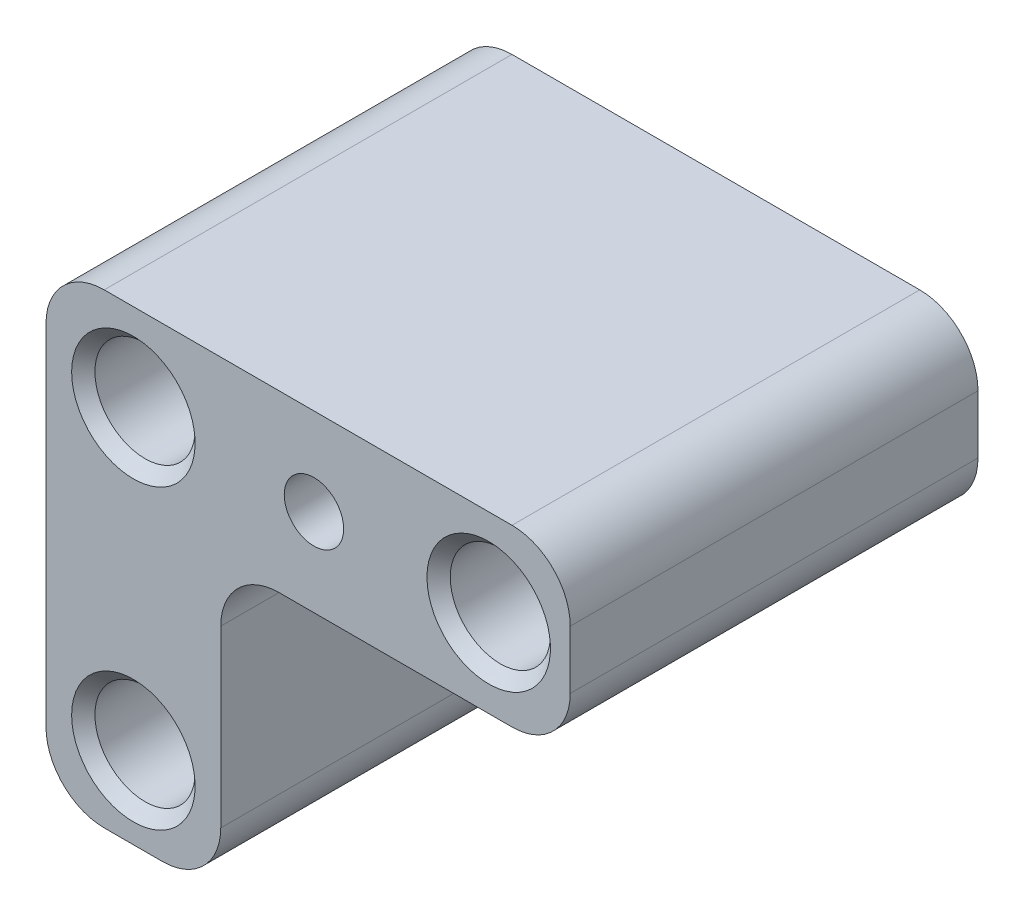
ISO-10303-21;
HEADER;
FILE_DESCRIPTION(('STEP AP214'),'2;1');
FILE_NAME('part.step','',(''),(''),'','','');
FILE_SCHEMA(('AUTOMOTIVE_DESIGN { 1 0 10303 214 1 1 1 1 }'));
ENDSEC;
DATA;
#1=APPLICATION_CONTEXT('core data for automotive mechanical design processes');
#2=APPLICATION_PROTOCOL_DEFINITION('international standard','automotive_design',2000,#1);
#3=PRODUCT_CONTEXT('',#1,'mechanical');
#4=PRODUCT('Part','Part','',(#3));
#5=PRODUCT_RELATED_PRODUCT_CATEGORY('part','',(#4));
#6=PRODUCT_DEFINITION_FORMATION('','',#4);
#7=PRODUCT_DEFINITION_CONTEXT('part definition',#1,'design');
#8=PRODUCT_DEFINITION('design','',#6,#7);
#9=PRODUCT_DEFINITION_SHAPE('','',#8);
#10=(LENGTH_UNIT() NAMED_UNIT(*) SI_UNIT(.MILLI.,.METRE.));
#11=(NAMED_UNIT(*) PLANE_ANGLE_UNIT() SI_UNIT($,.RADIAN.));
#12=(NAMED_UNIT(*) SI_UNIT($,.STERADIAN.) SOLID_ANGLE_UNIT());
#13=UNCERTAINTY_MEASURE_WITH_UNIT(LENGTH_MEASURE(1.E-05),#10,'distance_accuracy_value','');
#14=(GEOMETRIC_REPRESENTATION_CONTEXT(3) GLOBAL_UNCERTAINTY_ASSIGNED_CONTEXT((#13)) GLOBAL_UNIT_ASSIGNED_CONTEXT((#10,
#11,#12)) REPRESENTATION_CONTEXT('',''));
#15=CARTESIAN_POINT('',(0.,0.,0.));
#16=DIRECTION('',(0.,0.,1.));
#17=DIRECTION('',(1.,0.,0.));
#18=AXIS2_PLACEMENT_3D('',#15,#16,#17);
#19=CARTESIAN_POINT('',(-319.,352.5,35.));
#20=DIRECTION('',(0.,0.,-1.));
#21=DIRECTION('',(-1.,0.,0.));
#22=AXIS2_PLACEMENT_3D('',#19,#20,#21);
#23=CYLINDRICAL_SURFACE('',#22,2.55);
#24=CARTESIAN_POINT('',(-319.,352.5,0.));
#25=DIRECTION('',(0.,0.,1.));
#26=DIRECTION('',(1.,0.,0.));
#27=AXIS2_PLACEMENT_3D('',#24,#25,#26);
#28=CIRCLE('',#27,2.55);
#29=CARTESIAN_POINT('',(-316.45,352.5,0.));
#30=VERTEX_POINT('',#29);
#31=EDGE_CURVE('E240',#30,#30,#28,.T.);
#32=ORIENTED_EDGE('',*,*,#31,.F.);
#33=EDGE_LOOP('',(#32));
#34=FACE_BOUND('',#33,.T.);
#35=CARTESIAN_POINT('',(-319.,352.5,5.4));
#36=DIRECTION('',(0.,0.,1.));
#37=DIRECTION('',(1.,0.,0.));
#38=AXIS2_PLACEMENT_3D('',#35,#36,#37);
#39=CIRCLE('',#38,2.55);
#40=CARTESIAN_POINT('',(-316.45,352.5,5.4));
#41=VERTEX_POINT('',#40);
#42=EDGE_CURVE('E265',#41,#41,#39,.T.);
#43=ORIENTED_EDGE('',*,*,#42,.T.);
#44=EDGE_LOOP('',(#43));
#45=FACE_BOUND('',#44,.T.);
#46=ADVANCED_FACE('F116',(#34,#45),#23,.F.);
#47=CARTESIAN_POINT('',(-319.,327.,35.));
#48=DIRECTION('',(0.,0.,-1.));
#49=DIRECTION('',(-1.,0.,0.));
#50=AXIS2_PLACEMENT_3D('',#47,#48,#49);
#51=CYLINDRICAL_SURFACE('',#50,2.55);
#52=CARTESIAN_POINT('',(-319.,327.,0.));
#53=DIRECTION('',(0.,0.,1.));
#54=DIRECTION('',(1.,0.,0.));
#55=AXIS2_PLACEMENT_3D('',#52,#53,#54);
#56=CIRCLE('',#55,2.55);
#57=CARTESIAN_POINT('',(-316.45,327.,0.));
#58=VERTEX_POINT('',#57);
#59=EDGE_CURVE('E247',#58,#58,#56,.T.);
#60=ORIENTED_EDGE('',*,*,#59,.F.);
#61=EDGE_LOOP('',(#60));
#62=FACE_BOUND('',#61,.T.);
#63=CARTESIAN_POINT('',(-319.,327.,5.4));
#64=DIRECTION('',(0.,0.,1.));
#65=DIRECTION('',(1.,0.,0.));
#66=AXIS2_PLACEMENT_3D('',#63,#64,#65);
#67=CIRCLE('',#66,2.55);
#68=CARTESIAN_POINT('',(-316.45,327.,5.4));
#69=VERTEX_POINT('',#68);
#70=EDGE_CURVE('E282',#69,#69,#67,.T.);
#71=ORIENTED_EDGE('',*,*,#70,.T.);
#72=EDGE_LOOP('',(#71));
#73=FACE_BOUND('',#72,.T.);
#74=ADVANCED_FACE('F400',(#62,#73),#51,.F.);
#75=CARTESIAN_POINT('',(-288.5,352.5,35.));
#76=DIRECTION('',(0.,0.,-1.));
#77=DIRECTION('',(-1.,0.,0.));
#78=AXIS2_PLACEMENT_3D('',#75,#76,#77);
#79=CYLINDRICAL_SURFACE('',#78,2.55);
#80=CARTESIAN_POINT('',(-288.5,352.5,0.));
#81=DIRECTION('',(0.,0.,1.));
#82=DIRECTION('',(1.,0.,0.));
#83=AXIS2_PLACEMENT_3D('',#80,#81,#82);
#84=CIRCLE('',#83,2.55);
#85=CARTESIAN_POINT('',(-285.95,352.5,0.));
#86=VERTEX_POINT('',#85);
#87=EDGE_CURVE('E260',#86,#86,#84,.T.);
#88=ORIENTED_EDGE('',*,*,#87,.F.);
#89=EDGE_LOOP('',(#88));
#90=FACE_BOUND('',#89,.T.);
#91=CARTESIAN_POINT('',(-288.5,352.5,5.4));
#92=DIRECTION('',(0.,0.,1.));
#93=DIRECTION('',(1.,0.,0.));
#94=AXIS2_PLACEMENT_3D('',#91,#92,#93);
#95=CIRCLE('',#94,2.55);
#96=CARTESIAN_POINT('',(-285.95,352.5,5.4));
#97=VERTEX_POINT('',#96);
#98=EDGE_CURVE('E278',#97,#97,#95,.T.);
#99=ORIENTED_EDGE('',*,*,#98,.T.);
#100=EDGE_LOOP('',(#99));
#101=FACE_BOUND('',#100,.T.);
#102=ADVANCED_FACE('F406',(#90,#101),#79,.F.);
#103=CARTESIAN_POINT('',(-311.5,320.,35.));
#104=DIRECTION('',(-1.,0.,0.));
#105=DIRECTION('',(0.,0.,1.));
#106=AXIS2_PLACEMENT_3D('',#103,#104,#105);
#107=PLANE('',#106);
#108=DIRECTION('',(0.,1.,0.));
#109=VECTOR('',#108,1.);
#110=CARTESIAN_POINT('',(-311.5,320.,0.));
#111=LINE('',#110,#109);
#112=CARTESIAN_POINT('',(-311.5,325.,0.));
#113=VERTEX_POINT('',#112);
#114=CARTESIAN_POINT('',(-311.5,340.,0.));
#115=VERTEX_POINT('',#114);
#116=EDGE_CURVE('E256',#113,#115,#111,.T.);
#117=ORIENTED_EDGE('',*,*,#116,.T.);
#118=DIRECTION('',(0.,0.,-1.));
#119=VECTOR('',#118,1.);
#120=CARTESIAN_POINT('',(-311.5,340.,35.));
#121=LINE('',#120,#119);
#122=CARTESIAN_POINT('',(-311.5,340.,35.));
#123=VERTEX_POINT('',#122);
#124=EDGE_CURVE('E338',#115,#123,#121,.F.);
#125=ORIENTED_EDGE('',*,*,#124,.T.);
#126=DIRECTION('',(0.,1.,0.));
#127=VECTOR('',#126,1.);
#128=CARTESIAN_POINT('',(-311.5,320.,35.));
#129=LINE('',#128,#127);
#130=CARTESIAN_POINT('',(-311.5,325.,35.));
#131=VERTEX_POINT('',#130);
#132=EDGE_CURVE('E250',#131,#123,#129,.T.);
#133=ORIENTED_EDGE('',*,*,#132,.F.);
#134=DIRECTION('',(0.,0.,-1.));
#135=VECTOR('',#134,1.);
#136=CARTESIAN_POINT('',(-311.5,325.,0.));
#137=LINE('',#136,#135);
#138=EDGE_CURVE('E334',#131,#113,#137,.T.);
#139=ORIENTED_EDGE('',*,*,#138,.T.);
#140=EDGE_LOOP('',(#117,#125,#133,#139));
#141=FACE_BOUND('',#140,.T.);
#142=ADVANCED_FACE('F416',(#141),#107,.F.);
#143=CARTESIAN_POINT('',(0.,0.,35.));
#144=DIRECTION('',(0.,0.,-1.));
#145=DIRECTION('',(-1.,0.,0.));
#146=AXIS2_PLACEMENT_3D('',#143,#144,#145);
#147=PLANE('',#146);
#148=CARTESIAN_POINT('',(-288.5,352.5,35.));
#149=DIRECTION('',(0.,0.,-1.));
#150=DIRECTION('',(-1.,0.,0.));
#151=AXIS2_PLACEMENT_3D('',#148,#149,#150);
#152=CIRCLE('',#151,5.30000000000003);
#153=CARTESIAN_POINT('',(-293.8,352.5,35.));
#154=VERTEX_POINT('',#153);
#155=EDGE_CURVE('E372',#154,#154,#152,.T.);
#156=ORIENTED_EDGE('',*,*,#155,.T.);
#157=EDGE_LOOP('',(#156));
#158=FACE_BOUND('',#157,.T.);
#159=CARTESIAN_POINT('',(-319.,352.5,35.));
#160=DIRECTION('',(0.,0.,-1.));
#161=DIRECTION('',(-1.,0.,0.));
#162=AXIS2_PLACEMENT_3D('',#159,#160,#161);
#163=CIRCLE('',#162,5.30000000000003);
#164=CARTESIAN_POINT('',(-324.3,352.5,35.));
#165=VERTEX_POINT('',#164);
#166=EDGE_CURVE('E368',#165,#165,#163,.T.);
#167=ORIENTED_EDGE('',*,*,#166,.T.);
#168=EDGE_LOOP('',(#167));
#169=FACE_BOUND('',#168,.T.);
#170=CARTESIAN_POINT('',(-319.,327.,35.));
#171=DIRECTION('',(0.,0.,-1.));
#172=DIRECTION('',(-1.,0.,0.));
#173=AXIS2_PLACEMENT_3D('',#170,#171,#172);
#174=CIRCLE('',#173,5.30000000000003);
#175=CARTESIAN_POINT('',(-324.3,327.,35.));
#176=VERTEX_POINT('',#175);
#177=EDGE_CURVE('E364',#176,#176,#174,.T.);
#178=ORIENTED_EDGE('',*,*,#177,.T.);
#179=EDGE_LOOP('',(#178));
#180=FACE_BOUND('',#179,.T.);
#181=CARTESIAN_POINT('',(-303.5,352.5,35.));
#182=DIRECTION('',(0.,0.,-1.));
#183=DIRECTION('',(-1.,0.,0.));
#184=AXIS2_PLACEMENT_3D('',#181,#182,#183);
#185=CIRCLE('',#184,2.55);
#186=CARTESIAN_POINT('',(-306.05,352.5,35.));
#187=VERTEX_POINT('',#186);
#188=EDGE_CURVE('E290',#187,#187,#185,.T.);
#189=ORIENTED_EDGE('',*,*,#188,.T.);
#190=EDGE_LOOP('',(#189));
#191=FACE_BOUND('',#190,.T.);
#192=DIRECTION('',(0.,-1.,0.));
#193=VECTOR('',#192,1.);
#194=CARTESIAN_POINT('',(-281.5,360.,35.));
#195=LINE('',#194,#193);
#196=CARTESIAN_POINT('',(-281.5,355.,35.));
#197=VERTEX_POINT('',#196);
#198=CARTESIAN_POINT('',(-281.5,350.,35.));
#199=VERTEX_POINT('',#198);
#200=EDGE_CURVE('E266',#197,#199,#195,.T.);
#201=ORIENTED_EDGE('',*,*,#200,.F.);
#202=CARTESIAN_POINT('',(-286.5,355.,35.));
#203=DIRECTION('',(0.,0.,-1.));
#204=DIRECTION('',(-1.,0.,0.));
#205=AXIS2_PLACEMENT_3D('',#202,#203,#204);
#206=CIRCLE('',#205,5.);
#207=CARTESIAN_POINT('',(-286.5,360.,35.));
#208=VERTEX_POINT('',#207);
#209=EDGE_CURVE('E325',#197,#208,#206,.F.);
#210=ORIENTED_EDGE('',*,*,#209,.T.);
#211=DIRECTION('',(-1.,0.,0.));
#212=VECTOR('',#211,1.);
#213=CARTESIAN_POINT('',(-311.5,360.,35.));
#214=LINE('',#213,#212);
#215=CARTESIAN_POINT('',(-321.5,360.,35.));
#216=VERTEX_POINT('',#215);
#217=EDGE_CURVE('E230',#208,#216,#214,.T.);
#218=ORIENTED_EDGE('',*,*,#217,.T.);
#219=CARTESIAN_POINT('',(-321.5,355.,35.));
#220=DIRECTION('',(0.,0.,-1.));
#221=DIRECTION('',(-1.,0.,0.));
#222=AXIS2_PLACEMENT_3D('',#219,#220,#221);
#223=CIRCLE('',#222,5.);
#224=CARTESIAN_POINT('',(-326.5,355.,35.));
#225=VERTEX_POINT('',#224);
#226=EDGE_CURVE('E313',#216,#225,#223,.F.);
#227=ORIENTED_EDGE('',*,*,#226,.T.);
#228=DIRECTION('',(0.,1.,0.));
#229=VECTOR('',#228,1.);
#230=CARTESIAN_POINT('',(-326.5,320.,35.));
#231=LINE('',#230,#229);
#232=CARTESIAN_POINT('',(-326.5,325.,35.));
#233=VERTEX_POINT('',#232);
#234=EDGE_CURVE('E513',#233,#225,#231,.T.);
#235=ORIENTED_EDGE('',*,*,#234,.F.);
#236=CARTESIAN_POINT('',(-321.5,325.,35.));
#237=DIRECTION('',(0.,0.,-1.));
#238=DIRECTION('',(-1.,0.,0.));
#239=AXIS2_PLACEMENT_3D('',#236,#237,#238);
#240=CIRCLE('',#239,5.);
#241=CARTESIAN_POINT('',(-321.5,320.,35.));
#242=VERTEX_POINT('',#241);
#243=EDGE_CURVE('E316',#233,#242,#240,.F.);
#244=ORIENTED_EDGE('',*,*,#243,.T.);
#245=DIRECTION('',(-1.,0.,0.));
#246=VECTOR('',#245,1.);
#247=CARTESIAN_POINT('',(-311.5,320.,35.));
#248=LINE('',#247,#246);
#249=CARTESIAN_POINT('',(-316.5,320.,35.));
#250=VERTEX_POINT('',#249);
#251=EDGE_CURVE('E516',#250,#242,#248,.T.);
#252=ORIENTED_EDGE('',*,*,#251,.F.);
#253=CARTESIAN_POINT('',(-316.5,325.,35.));
#254=DIRECTION('',(0.,0.,-1.));
#255=DIRECTION('',(-1.,0.,0.));
#256=AXIS2_PLACEMENT_3D('',#253,#254,#255);
#257=CIRCLE('',#256,5.);
#258=EDGE_CURVE('E319',#250,#131,#257,.F.);
#259=ORIENTED_EDGE('',*,*,#258,.T.);
#260=ORIENTED_EDGE('',*,*,#132,.T.);
#261=CARTESIAN_POINT('',(-306.5,340.,35.));
#262=DIRECTION('',(0.,0.,-1.));
#263=DIRECTION('',(-1.,0.,0.));
#264=AXIS2_PLACEMENT_3D('',#261,#262,#263);
#265=CIRCLE('',#264,5.);
#266=CARTESIAN_POINT('',(-306.5,345.,35.));
#267=VERTEX_POINT('',#266);
#268=EDGE_CURVE('E140',#123,#267,#265,.T.);
#269=ORIENTED_EDGE('',*,*,#268,.T.);
#270=DIRECTION('',(1.,0.,0.));
#271=VECTOR('',#270,1.);
#272=CARTESIAN_POINT('',(-311.5,345.,35.));
#273=LINE('',#272,#271);
#274=CARTESIAN_POINT('',(-286.5,345.,35.));
#275=VERTEX_POINT('',#274);
#276=EDGE_CURVE('E270',#267,#275,#273,.T.);
#277=ORIENTED_EDGE('',*,*,#276,.T.);
#278=CARTESIAN_POINT('',(-286.5,350.,35.));
#279=DIRECTION('',(0.,0.,-1.));
#280=DIRECTION('',(-1.,0.,0.));
#281=AXIS2_PLACEMENT_3D('',#278,#279,#280);
#282=CIRCLE('',#281,5.);
#283=EDGE_CURVE('E322',#275,#199,#282,.F.);
#284=ORIENTED_EDGE('',*,*,#283,.T.);
#285=EDGE_LOOP('',(#201,#210,#218,#227,#235,#244,#252,#259,#260,#269,#277,#284));
#286=FACE_BOUND('',#285,.T.);
#287=ADVANCED_FACE('F413',(#158,#169,#180,#191,#286),#147,.F.);
#288=CARTESIAN_POINT('',(0.,0.,0.));
#289=DIRECTION('',(0.,0.,-1.));
#290=DIRECTION('',(-1.,0.,0.));
#291=AXIS2_PLACEMENT_3D('',#288,#289,#290);
#292=PLANE('',#291);
#293=CARTESIAN_POINT('',(-303.5,352.5,0.));
#294=DIRECTION('',(0.,0.,-1.));
#295=DIRECTION('',(-1.,0.,0.));
#296=AXIS2_PLACEMENT_3D('',#293,#294,#295);
#297=CIRCLE('',#296,5.30000000000003);
#298=CARTESIAN_POINT('',(-308.8,352.5,0.));
#299=VERTEX_POINT('',#298);
#300=EDGE_CURVE('E12',#299,#299,#297,.F.);
#301=ORIENTED_EDGE('',*,*,#300,.T.);
#302=EDGE_LOOP('',(#301));
#303=FACE_BOUND('',#302,.T.);
#304=ORIENTED_EDGE('',*,*,#31,.T.);
#305=EDGE_LOOP('',(#304));
#306=FACE_BOUND('',#305,.T.);
#307=DIRECTION('',(-1.,0.,0.));
#308=VECTOR('',#307,1.);
#309=CARTESIAN_POINT('',(-311.5,360.,0.));
#310=LINE('',#309,#308);
#311=CARTESIAN_POINT('',(-286.5,360.,0.));
#312=VERTEX_POINT('',#311);
#313=CARTESIAN_POINT('',(-321.5,360.,0.));
#314=VERTEX_POINT('',#313);
#315=EDGE_CURVE('E227',#312,#314,#310,.T.);
#316=ORIENTED_EDGE('',*,*,#315,.F.);
#317=CARTESIAN_POINT('',(-286.5,355.,0.));
#318=DIRECTION('',(0.,0.,-1.));
#319=DIRECTION('',(-1.,0.,0.));
#320=AXIS2_PLACEMENT_3D('',#317,#318,#319);
#321=CIRCLE('',#320,5.);
#322=CARTESIAN_POINT('',(-281.5,355.,0.));
#323=VERTEX_POINT('',#322);
#324=EDGE_CURVE('E209',#312,#323,#321,.T.);
#325=ORIENTED_EDGE('',*,*,#324,.T.);
#326=DIRECTION('',(0.,-1.,0.));
#327=VECTOR('',#326,1.);
#328=CARTESIAN_POINT('',(-281.5,360.,0.));
#329=LINE('',#328,#327);
#330=CARTESIAN_POINT('',(-281.5,350.,0.));
#331=VERTEX_POINT('',#330);
#332=EDGE_CURVE('E264',#323,#331,#329,.T.);
#333=ORIENTED_EDGE('',*,*,#332,.T.);
#334=CARTESIAN_POINT('',(-286.5,350.,0.));
#335=DIRECTION('',(0.,0.,-1.));
#336=DIRECTION('',(-1.,0.,0.));
#337=AXIS2_PLACEMENT_3D('',#334,#335,#336);
#338=CIRCLE('',#337,5.);
#339=CARTESIAN_POINT('',(-286.5,345.,0.));
#340=VERTEX_POINT('',#339);
#341=EDGE_CURVE('E221',#331,#340,#338,.T.);
#342=ORIENTED_EDGE('',*,*,#341,.T.);
#343=DIRECTION('',(1.,0.,0.));
#344=VECTOR('',#343,1.);
#345=CARTESIAN_POINT('',(-311.5,345.,0.));
#346=LINE('',#345,#344);
#347=CARTESIAN_POINT('',(-306.5,345.,0.));
#348=VERTEX_POINT('',#347);
#349=EDGE_CURVE('E271',#348,#340,#346,.T.);
#350=ORIENTED_EDGE('',*,*,#349,.F.);
#351=CARTESIAN_POINT('',(-306.5,340.,0.));
#352=DIRECTION('',(0.,0.,-1.));
#353=DIRECTION('',(-1.,0.,0.));
#354=AXIS2_PLACEMENT_3D('',#351,#352,#353);
#355=CIRCLE('',#354,5.);
#356=EDGE_CURVE('E355',#348,#115,#355,.F.);
#357=ORIENTED_EDGE('',*,*,#356,.T.);
#358=ORIENTED_EDGE('',*,*,#116,.F.);
#359=CARTESIAN_POINT('',(-316.5,325.,0.));
#360=DIRECTION('',(0.,0.,-1.));
#361=DIRECTION('',(-1.,0.,0.));
#362=AXIS2_PLACEMENT_3D('',#359,#360,#361);
#363=CIRCLE('',#362,5.);
#364=CARTESIAN_POINT('',(-316.5,320.,0.));
#365=VERTEX_POINT('',#364);
#366=EDGE_CURVE('E303',#113,#365,#363,.T.);
#367=ORIENTED_EDGE('',*,*,#366,.T.);
#368=DIRECTION('',(-1.,0.,0.));
#369=VECTOR('',#368,1.);
#370=CARTESIAN_POINT('',(-311.5,320.,0.));
#371=LINE('',#370,#369);
#372=CARTESIAN_POINT('',(-321.5,320.,0.));
#373=VERTEX_POINT('',#372);
#374=EDGE_CURVE('E244',#365,#373,#371,.T.);
#375=ORIENTED_EDGE('',*,*,#374,.T.);
#376=CARTESIAN_POINT('',(-321.5,325.,0.));
#377=DIRECTION('',(0.,0.,-1.));
#378=DIRECTION('',(-1.,0.,0.));
#379=AXIS2_PLACEMENT_3D('',#376,#377,#378);
#380=CIRCLE('',#379,5.);
#381=CARTESIAN_POINT('',(-326.5,325.,0.));
#382=VERTEX_POINT('',#381);
#383=EDGE_CURVE('E300',#373,#382,#380,.T.);
#384=ORIENTED_EDGE('',*,*,#383,.T.);
#385=DIRECTION('',(0.,1.,0.));
#386=VECTOR('',#385,1.);
#387=CARTESIAN_POINT('',(-326.5,320.,0.));
#388=LINE('',#387,#386);
#389=CARTESIAN_POINT('',(-326.5,355.,0.));
#390=VERTEX_POINT('',#389);
#391=EDGE_CURVE('E239',#382,#390,#388,.T.);
#392=ORIENTED_EDGE('',*,*,#391,.T.);
#393=CARTESIAN_POINT('',(-321.5,355.,0.));
#394=DIRECTION('',(0.,0.,-1.));
#395=DIRECTION('',(-1.,0.,0.));
#396=AXIS2_PLACEMENT_3D('',#393,#394,#395);
#397=CIRCLE('',#396,5.);
#398=EDGE_CURVE('E232',#390,#314,#397,.T.);
#399=ORIENTED_EDGE('',*,*,#398,.T.);
#400=EDGE_LOOP('',(#316,#325,#333,#342,#350,#357,#358,#367,#375,#384,#392,#399));
#401=FACE_BOUND('',#400,.T.);
#402=ORIENTED_EDGE('',*,*,#59,.T.);
#403=EDGE_LOOP('',(#402));
#404=FACE_BOUND('',#403,.T.);
#405=ORIENTED_EDGE('',*,*,#87,.T.);
#406=EDGE_LOOP('',(#405));
#407=FACE_BOUND('',#406,.T.);
#408=ADVANCED_FACE('F235',(#303,#306,#401,#404,#407),#292,.T.);
#409=CARTESIAN_POINT('',(-311.5,360.,35.));
#410=DIRECTION('',(0.,-1.,0.));
#411=DIRECTION('',(0.,0.,-1.));
#412=AXIS2_PLACEMENT_3D('',#409,#410,#411);
#413=PLANE('',#412);
#414=ORIENTED_EDGE('',*,*,#217,.F.);
#415=DIRECTION('',(0.,0.,-1.));
#416=VECTOR('',#415,1.);
#417=CARTESIAN_POINT('',(-286.5,360.,0.));
#418=LINE('',#417,#416);
#419=EDGE_CURVE('E213',#208,#312,#418,.T.);
#420=ORIENTED_EDGE('',*,*,#419,.T.);
#421=ORIENTED_EDGE('',*,*,#315,.T.);
#422=DIRECTION('',(0.,0.,-1.));
#423=VECTOR('',#422,1.);
#424=CARTESIAN_POINT('',(-321.5,360.,35.));
#425=LINE('',#424,#423);
#426=EDGE_CURVE('E233',#314,#216,#425,.F.);
#427=ORIENTED_EDGE('',*,*,#426,.T.);
#428=EDGE_LOOP('',(#414,#420,#421,#427));
#429=FACE_BOUND('',#428,.T.);
#430=ADVANCED_FACE('F226',(#429),#413,.F.);
#431=CARTESIAN_POINT('',(-326.5,320.,35.));
#432=DIRECTION('',(-1.,0.,0.));
#433=DIRECTION('',(0.,0.,1.));
#434=AXIS2_PLACEMENT_3D('',#431,#432,#433);
#435=PLANE('',#434);
#436=ORIENTED_EDGE('',*,*,#391,.F.);
#437=DIRECTION('',(0.,0.,-1.));
#438=VECTOR('',#437,1.);
#439=CARTESIAN_POINT('',(-326.5,325.,35.));
#440=LINE('',#439,#438);
#441=EDGE_CURVE('E352',#382,#233,#440,.F.);
#442=ORIENTED_EDGE('',*,*,#441,.T.);
#443=ORIENTED_EDGE('',*,*,#234,.T.);
#444=DIRECTION('',(0.,0.,-1.));
#445=VECTOR('',#444,1.);
#446=CARTESIAN_POINT('',(-326.5,355.,0.));
#447=LINE('',#446,#445);
#448=EDGE_CURVE('E348',#225,#390,#447,.T.);
#449=ORIENTED_EDGE('',*,*,#448,.T.);
#450=EDGE_LOOP('',(#436,#442,#443,#449));
#451=FACE_BOUND('',#450,.T.);
#452=ADVANCED_FACE('F428',(#451),#435,.T.);
#453=CARTESIAN_POINT('',(-311.5,320.,35.));
#454=DIRECTION('',(0.,-1.,0.));
#455=DIRECTION('',(0.,0.,-1.));
#456=AXIS2_PLACEMENT_3D('',#453,#454,#455);
#457=PLANE('',#456);
#458=ORIENTED_EDGE('',*,*,#374,.F.);
#459=DIRECTION('',(0.,0.,-1.));
#460=VECTOR('',#459,1.);
#461=CARTESIAN_POINT('',(-316.5,320.,35.));
#462=LINE('',#461,#460);
#463=EDGE_CURVE('E345',#365,#250,#462,.F.);
#464=ORIENTED_EDGE('',*,*,#463,.T.);
#465=ORIENTED_EDGE('',*,*,#251,.T.);
#466=DIRECTION('',(0.,0.,-1.));
#467=VECTOR('',#466,1.);
#468=CARTESIAN_POINT('',(-321.5,320.,35.));
#469=LINE('',#468,#467);
#470=EDGE_CURVE('E341',#242,#373,#469,.T.);
#471=ORIENTED_EDGE('',*,*,#470,.T.);
#472=EDGE_LOOP('',(#458,#464,#465,#471));
#473=FACE_BOUND('',#472,.T.);
#474=ADVANCED_FACE('F425',(#473),#457,.T.);
#475=CARTESIAN_POINT('',(-281.5,360.,35.));
#476=DIRECTION('',(1.,0.,0.));
#477=DIRECTION('',(0.,0.,-1.));
#478=AXIS2_PLACEMENT_3D('',#475,#476,#477);
#479=PLANE('',#478);
#480=ORIENTED_EDGE('',*,*,#332,.F.);
#481=DIRECTION('',(0.,0.,-1.));
#482=VECTOR('',#481,1.);
#483=CARTESIAN_POINT('',(-281.5,355.,35.));
#484=LINE('',#483,#482);
#485=EDGE_CURVE('E214',#323,#197,#484,.F.);
#486=ORIENTED_EDGE('',*,*,#485,.T.);
#487=ORIENTED_EDGE('',*,*,#200,.T.);
#488=DIRECTION('',(0.,0.,-1.));
#489=VECTOR('',#488,1.);
#490=CARTESIAN_POINT('',(-281.5,350.,0.));
#491=LINE('',#490,#489);
#492=EDGE_CURVE('E220',#199,#331,#491,.T.);
#493=ORIENTED_EDGE('',*,*,#492,.T.);
#494=EDGE_LOOP('',(#480,#486,#487,#493));
#495=FACE_BOUND('',#494,.T.);
#496=ADVANCED_FACE('F424',(#495),#479,.T.);
#497=CARTESIAN_POINT('',(-311.5,345.,35.));
#498=DIRECTION('',(0.,1.,0.));
#499=DIRECTION('',(0.,0.,1.));
#500=AXIS2_PLACEMENT_3D('',#497,#498,#499);
#501=PLANE('',#500);
#502=ORIENTED_EDGE('',*,*,#349,.T.);
#503=DIRECTION('',(0.,0.,-1.));
#504=VECTOR('',#503,1.);
#505=CARTESIAN_POINT('',(-286.5,345.,35.));
#506=LINE('',#505,#504);
#507=EDGE_CURVE('E133',#340,#275,#506,.F.);
#508=ORIENTED_EDGE('',*,*,#507,.T.);
#509=ORIENTED_EDGE('',*,*,#276,.F.);
#510=DIRECTION('',(0.,0.,-1.));
#511=VECTOR('',#510,1.);
#512=CARTESIAN_POINT('',(-306.5,345.,0.));
#513=LINE('',#512,#511);
#514=EDGE_CURVE('E328',#267,#348,#513,.T.);
#515=ORIENTED_EDGE('',*,*,#514,.T.);
#516=EDGE_LOOP('',(#502,#508,#509,#515));
#517=FACE_BOUND('',#516,.T.);
#518=ADVANCED_FACE('F439',(#517),#501,.F.);
#519=CARTESIAN_POINT('',(-288.5,352.5,5.4));
#520=DIRECTION('',(0.,0.,1.));
#521=DIRECTION('',(1.,0.,0.));
#522=AXIS2_PLACEMENT_3D('',#519,#520,#521);
#523=CYLINDRICAL_SURFACE('',#522,4.30000000000004);
#524=CARTESIAN_POINT('',(-288.5,352.5,34.));
#525=DIRECTION('',(0.,0.,-1.));
#526=DIRECTION('',(-1.,0.,0.));
#527=AXIS2_PLACEMENT_3D('',#524,#525,#526);
#528=CIRCLE('',#527,4.30000000000004);
#529=CARTESIAN_POINT('',(-292.8,352.5,34.));
#530=VERTEX_POINT('',#529);
#531=EDGE_CURVE('E360',#530,#530,#528,.F.);
#532=ORIENTED_EDGE('',*,*,#531,.T.);
#533=EDGE_LOOP('',(#532));
#534=FACE_BOUND('',#533,.T.);
#535=CARTESIAN_POINT('',(-288.5,352.5,5.4));
#536=DIRECTION('',(0.,0.,1.));
#537=DIRECTION('',(1.,0.,0.));
#538=AXIS2_PLACEMENT_3D('',#535,#536,#537);
#539=CIRCLE('',#538,4.30000000000004);
#540=CARTESIAN_POINT('',(-284.2,352.5,5.4));
#541=VERTEX_POINT('',#540);
#542=EDGE_CURVE('E504',#541,#541,#539,.T.);
#543=ORIENTED_EDGE('',*,*,#542,.F.);
#544=EDGE_LOOP('',(#543));
#545=FACE_BOUND('',#544,.T.);
#546=ADVANCED_FACE('F430',(#534,#545),#523,.F.);
#547=CARTESIAN_POINT('',(-288.5,352.5,5.4));
#548=DIRECTION('',(0.,0.,1.));
#549=DIRECTION('',(1.,0.,0.));
#550=AXIS2_PLACEMENT_3D('',#547,#548,#549);
#551=PLANE('',#550);
#552=ORIENTED_EDGE('',*,*,#98,.F.);
#553=EDGE_LOOP('',(#552));
#554=FACE_BOUND('',#553,.T.);
#555=ORIENTED_EDGE('',*,*,#542,.T.);
#556=EDGE_LOOP('',(#555));
#557=FACE_BOUND('',#556,.T.);
#558=ADVANCED_FACE('F552',(#554,#557),#551,.T.);
#559=CARTESIAN_POINT('',(-319.,327.,5.4));
#560=DIRECTION('',(0.,0.,1.));
#561=DIRECTION('',(1.,0.,0.));
#562=AXIS2_PLACEMENT_3D('',#559,#560,#561);
#563=CYLINDRICAL_SURFACE('',#562,4.30000000000004);
#564=CARTESIAN_POINT('',(-319.,327.,34.));
#565=DIRECTION('',(0.,0.,-1.));
#566=DIRECTION('',(-1.,0.,0.));
#567=AXIS2_PLACEMENT_3D('',#564,#565,#566);
#568=CIRCLE('',#567,4.30000000000004);
#569=CARTESIAN_POINT('',(-323.3,327.,34.));
#570=VERTEX_POINT('',#569);
#571=EDGE_CURVE('E380',#570,#570,#568,.F.);
#572=ORIENTED_EDGE('',*,*,#571,.T.);
#573=EDGE_LOOP('',(#572));
#574=FACE_BOUND('',#573,.T.);
#575=CARTESIAN_POINT('',(-319.,327.,5.4));
#576=DIRECTION('',(0.,0.,1.));
#577=DIRECTION('',(1.,0.,0.));
#578=AXIS2_PLACEMENT_3D('',#575,#576,#577);
#579=CIRCLE('',#578,4.30000000000004);
#580=CARTESIAN_POINT('',(-314.7,327.,5.4));
#581=VERTEX_POINT('',#580);
#582=EDGE_CURVE('E500',#581,#581,#579,.T.);
#583=ORIENTED_EDGE('',*,*,#582,.F.);
#584=EDGE_LOOP('',(#583));
#585=FACE_BOUND('',#584,.T.);
#586=ADVANCED_FACE('F547',(#574,#585),#563,.F.);
#587=CARTESIAN_POINT('',(-319.,327.,5.4));
#588=DIRECTION('',(0.,0.,1.));
#589=DIRECTION('',(1.,0.,0.));
#590=AXIS2_PLACEMENT_3D('',#587,#588,#589);
#591=PLANE('',#590);
#592=ORIENTED_EDGE('',*,*,#70,.F.);
#593=EDGE_LOOP('',(#592));
#594=FACE_BOUND('',#593,.T.);
#595=ORIENTED_EDGE('',*,*,#582,.T.);
#596=EDGE_LOOP('',(#595));
#597=FACE_BOUND('',#596,.T.);
#598=ADVANCED_FACE('F495',(#594,#597),#591,.T.);
#599=CARTESIAN_POINT('',(-319.,352.5,5.4));
#600=DIRECTION('',(0.,0.,1.));
#601=DIRECTION('',(1.,0.,0.));
#602=AXIS2_PLACEMENT_3D('',#599,#600,#601);
#603=CYLINDRICAL_SURFACE('',#602,4.30000000000004);
#604=CARTESIAN_POINT('',(-319.,352.5,34.));
#605=DIRECTION('',(0.,0.,-1.));
#606=DIRECTION('',(-1.,0.,0.));
#607=AXIS2_PLACEMENT_3D('',#604,#605,#606);
#608=CIRCLE('',#607,4.30000000000004);
#609=CARTESIAN_POINT('',(-323.3,352.5,34.));
#610=VERTEX_POINT('',#609);
#611=EDGE_CURVE('E376',#610,#610,#608,.F.);
#612=ORIENTED_EDGE('',*,*,#611,.T.);
#613=EDGE_LOOP('',(#612));
#614=FACE_BOUND('',#613,.T.);
#615=CARTESIAN_POINT('',(-319.,352.5,5.4));
#616=DIRECTION('',(0.,0.,1.));
#617=DIRECTION('',(1.,0.,0.));
#618=AXIS2_PLACEMENT_3D('',#615,#616,#617);
#619=CIRCLE('',#618,4.30000000000004);
#620=CARTESIAN_POINT('',(-314.7,352.5,5.4));
#621=VERTEX_POINT('',#620);
#622=EDGE_CURVE('E283',#621,#621,#619,.T.);
#623=ORIENTED_EDGE('',*,*,#622,.F.);
#624=EDGE_LOOP('',(#623));
#625=FACE_BOUND('',#624,.T.);
#626=ADVANCED_FACE('F491',(#614,#625),#603,.F.);
#627=CARTESIAN_POINT('',(-319.,352.5,5.4));
#628=DIRECTION('',(0.,0.,1.));
#629=DIRECTION('',(1.,0.,0.));
#630=AXIS2_PLACEMENT_3D('',#627,#628,#629);
#631=PLANE('',#630);
#632=ORIENTED_EDGE('',*,*,#42,.F.);
#633=EDGE_LOOP('',(#632));
#634=FACE_BOUND('',#633,.T.);
#635=ORIENTED_EDGE('',*,*,#622,.T.);
#636=EDGE_LOOP('',(#635));
#637=FACE_BOUND('',#636,.T.);
#638=ADVANCED_FACE('F494',(#634,#637),#631,.T.);
#639=CARTESIAN_POINT('',(-303.5,352.5,29.6));
#640=DIRECTION('',(0.,0.,-1.));
#641=DIRECTION('',(-1.,0.,0.));
#642=AXIS2_PLACEMENT_3D('',#639,#640,#641);
#643=CYLINDRICAL_SURFACE('',#642,4.30000000000004);
#644=CARTESIAN_POINT('',(-303.5,352.5,0.99999999999999));
#645=DIRECTION('',(0.,0.,-1.));
#646=DIRECTION('',(-1.,0.,0.));
#647=AXIS2_PLACEMENT_3D('',#644,#645,#646);
#648=CIRCLE('',#647,4.30000000000004);
#649=CARTESIAN_POINT('',(-307.8,352.5,0.99999999999999));
#650=VERTEX_POINT('',#649);
#651=EDGE_CURVE('E126',#650,#650,#648,.T.);
#652=ORIENTED_EDGE('',*,*,#651,.T.);
#653=EDGE_LOOP('',(#652));
#654=FACE_BOUND('',#653,.T.);
#655=CARTESIAN_POINT('',(-303.5,352.5,29.6));
#656=DIRECTION('',(0.,0.,-1.));
#657=DIRECTION('',(-1.,0.,0.));
#658=AXIS2_PLACEMENT_3D('',#655,#656,#657);
#659=CIRCLE('',#658,4.30000000000004);
#660=CARTESIAN_POINT('',(-307.8,352.5,29.6));
#661=VERTEX_POINT('',#660);
#662=EDGE_CURVE('E294',#661,#661,#659,.T.);
#663=ORIENTED_EDGE('',*,*,#662,.F.);
#664=EDGE_LOOP('',(#663));
#665=FACE_BOUND('',#664,.T.);
#666=ADVANCED_FACE('F387',(#654,#665),#643,.F.);
#667=CARTESIAN_POINT('',(-303.5,352.5,29.6));
#668=DIRECTION('',(0.,0.,-1.));
#669=DIRECTION('',(-1.,0.,0.));
#670=AXIS2_PLACEMENT_3D('',#667,#668,#669);
#671=PLANE('',#670);
#672=CARTESIAN_POINT('',(-303.5,352.5,29.6));
#673=DIRECTION('',(0.,0.,-1.));
#674=DIRECTION('',(-1.,0.,0.));
#675=AXIS2_PLACEMENT_3D('',#672,#673,#674);
#676=CIRCLE('',#675,2.55);
#677=CARTESIAN_POINT('',(-306.05,352.5,29.6));
#678=VERTEX_POINT('',#677);
#679=EDGE_CURVE('E295',#678,#678,#676,.T.);
#680=ORIENTED_EDGE('',*,*,#679,.F.);
#681=EDGE_LOOP('',(#680));
#682=FACE_BOUND('',#681,.T.);
#683=ORIENTED_EDGE('',*,*,#662,.T.);
#684=EDGE_LOOP('',(#683));
#685=FACE_BOUND('',#684,.T.);
#686=ADVANCED_FACE('F572',(#682,#685),#671,.T.);
#687=CARTESIAN_POINT('',(-303.5,352.5,59.2));
#688=DIRECTION('',(0.,0.,-1.));
#689=DIRECTION('',(-1.,0.,0.));
#690=AXIS2_PLACEMENT_3D('',#687,#688,#689);
#691=CYLINDRICAL_SURFACE('',#690,2.55);
#692=ORIENTED_EDGE('',*,*,#679,.T.);
#693=EDGE_LOOP('',(#692));
#694=FACE_BOUND('',#693,.T.);
#695=ORIENTED_EDGE('',*,*,#188,.F.);
#696=EDGE_LOOP('',(#695));
#697=FACE_BOUND('',#696,.T.);
#698=ADVANCED_FACE('F448',(#694,#697),#691,.F.);
#699=CARTESIAN_POINT('',(-286.5,355.,35.));
#700=DIRECTION('',(0.,0.,1.));
#701=DIRECTION('',(1.,0.,0.));
#702=AXIS2_PLACEMENT_3D('',#699,#700,#701);
#703=CYLINDRICAL_SURFACE('',#702,5.);
#704=ORIENTED_EDGE('',*,*,#209,.F.);
#705=ORIENTED_EDGE('',*,*,#485,.F.);
#706=ORIENTED_EDGE('',*,*,#324,.F.);
#707=ORIENTED_EDGE('',*,*,#419,.F.);
#708=EDGE_LOOP('',(#704,#705,#706,#707));
#709=FACE_BOUND('',#708,.T.);
#710=ADVANCED_FACE('F212',(#709),#703,.T.);
#711=CARTESIAN_POINT('',(-286.5,350.,35.));
#712=DIRECTION('',(0.,0.,1.));
#713=DIRECTION('',(1.,0.,0.));
#714=AXIS2_PLACEMENT_3D('',#711,#712,#713);
#715=CYLINDRICAL_SURFACE('',#714,5.);
#716=ORIENTED_EDGE('',*,*,#283,.F.);
#717=ORIENTED_EDGE('',*,*,#507,.F.);
#718=ORIENTED_EDGE('',*,*,#341,.F.);
#719=ORIENTED_EDGE('',*,*,#492,.F.);
#720=EDGE_LOOP('',(#716,#717,#718,#719));
#721=FACE_BOUND('',#720,.T.);
#722=ADVANCED_FACE('F447',(#721),#715,.T.);
#723=CARTESIAN_POINT('',(-306.5,340.,35.));
#724=DIRECTION('',(0.,0.,1.));
#725=DIRECTION('',(1.,0.,0.));
#726=AXIS2_PLACEMENT_3D('',#723,#724,#725);
#727=CYLINDRICAL_SURFACE('',#726,5.);
#728=ORIENTED_EDGE('',*,*,#268,.F.);
#729=ORIENTED_EDGE('',*,*,#124,.F.);
#730=ORIENTED_EDGE('',*,*,#356,.F.);
#731=ORIENTED_EDGE('',*,*,#514,.F.);
#732=EDGE_LOOP('',(#728,#729,#730,#731));
#733=FACE_BOUND('',#732,.T.);
#734=ADVANCED_FACE('F451',(#733),#727,.F.);
#735=CARTESIAN_POINT('',(-316.5,325.,35.));
#736=DIRECTION('',(0.,0.,1.));
#737=DIRECTION('',(1.,0.,0.));
#738=AXIS2_PLACEMENT_3D('',#735,#736,#737);
#739=CYLINDRICAL_SURFACE('',#738,5.);
#740=ORIENTED_EDGE('',*,*,#258,.F.);
#741=ORIENTED_EDGE('',*,*,#463,.F.);
#742=ORIENTED_EDGE('',*,*,#366,.F.);
#743=ORIENTED_EDGE('',*,*,#138,.F.);
#744=EDGE_LOOP('',(#740,#741,#742,#743));
#745=FACE_BOUND('',#744,.T.);
#746=ADVANCED_FACE('F455',(#745),#739,.T.);
#747=CARTESIAN_POINT('',(-321.5,325.,35.));
#748=DIRECTION('',(0.,0.,-1.));
#749=DIRECTION('',(-1.,0.,0.));
#750=AXIS2_PLACEMENT_3D('',#747,#748,#749);
#751=CYLINDRICAL_SURFACE('',#750,5.);
#752=ORIENTED_EDGE('',*,*,#243,.F.);
#753=ORIENTED_EDGE('',*,*,#441,.F.);
#754=ORIENTED_EDGE('',*,*,#383,.F.);
#755=ORIENTED_EDGE('',*,*,#470,.F.);
#756=EDGE_LOOP('',(#752,#753,#754,#755));
#757=FACE_BOUND('',#756,.T.);
#758=ADVANCED_FACE('F459',(#757),#751,.T.);
#759=CARTESIAN_POINT('',(-321.5,355.,35.));
#760=DIRECTION('',(0.,0.,1.));
#761=DIRECTION('',(1.,0.,0.));
#762=AXIS2_PLACEMENT_3D('',#759,#760,#761);
#763=CYLINDRICAL_SURFACE('',#762,5.);
#764=ORIENTED_EDGE('',*,*,#226,.F.);
#765=ORIENTED_EDGE('',*,*,#426,.F.);
#766=ORIENTED_EDGE('',*,*,#398,.F.);
#767=ORIENTED_EDGE('',*,*,#448,.F.);
#768=EDGE_LOOP('',(#764,#765,#766,#767));
#769=FACE_BOUND('',#768,.T.);
#770=ADVANCED_FACE('F463',(#769),#763,.T.);
#771=CARTESIAN_POINT('',(-288.5,352.5,34.));
#772=DIRECTION('',(0.,0.,1.));
#773=DIRECTION('',(1.,0.,0.));
#774=AXIS2_PLACEMENT_3D('',#771,#772,#773);
#775=CONICAL_SURFACE('',#774,4.30000000000004,0.785398163397447);
#776=ORIENTED_EDGE('',*,*,#155,.F.);
#777=EDGE_LOOP('',(#776));
#778=FACE_BOUND('',#777,.T.);
#779=ORIENTED_EDGE('',*,*,#531,.F.);
#780=EDGE_LOOP('',(#779));
#781=FACE_BOUND('',#780,.T.);
#782=ADVANCED_FACE('F467',(#778,#781),#775,.F.);
#783=CARTESIAN_POINT('',(-319.,352.5,34.));
#784=DIRECTION('',(0.,0.,1.));
#785=DIRECTION('',(1.,0.,0.));
#786=AXIS2_PLACEMENT_3D('',#783,#784,#785);
#787=CONICAL_SURFACE('',#786,4.30000000000004,0.785398163397447);
#788=ORIENTED_EDGE('',*,*,#166,.F.);
#789=EDGE_LOOP('',(#788));
#790=FACE_BOUND('',#789,.T.);
#791=ORIENTED_EDGE('',*,*,#611,.F.);
#792=EDGE_LOOP('',(#791));
#793=FACE_BOUND('',#792,.T.);
#794=ADVANCED_FACE('F396',(#790,#793),#787,.F.);
#795=CARTESIAN_POINT('',(-319.,327.,34.));
#796=DIRECTION('',(0.,0.,1.));
#797=DIRECTION('',(1.,0.,0.));
#798=AXIS2_PLACEMENT_3D('',#795,#796,#797);
#799=CONICAL_SURFACE('',#798,4.30000000000004,0.785398163397447);
#800=ORIENTED_EDGE('',*,*,#177,.F.);
#801=EDGE_LOOP('',(#800));
#802=FACE_BOUND('',#801,.T.);
#803=ORIENTED_EDGE('',*,*,#571,.F.);
#804=EDGE_LOOP('',(#803));
#805=FACE_BOUND('',#804,.T.);
#806=ADVANCED_FACE('F391',(#802,#805),#799,.F.);
#807=CARTESIAN_POINT('',(-303.5,352.5,0.99999999999999));
#808=DIRECTION('',(0.,0.,-1.));
#809=DIRECTION('',(-1.,0.,0.));
#810=AXIS2_PLACEMENT_3D('',#807,#808,#809);
#811=CONICAL_SURFACE('',#810,4.30000000000004,0.785398163397448);
#812=ORIENTED_EDGE('',*,*,#300,.F.);
#813=EDGE_LOOP('',(#812));
#814=FACE_BOUND('',#813,.T.);
#815=ORIENTED_EDGE('',*,*,#651,.F.);
#816=EDGE_LOOP('',(#815));
#817=FACE_BOUND('',#816,.T.);
#818=ADVANCED_FACE('F119',(#814,#817),#811,.F.);
#819=CLOSED_SHELL('',(#46,#74,#102,#142,#287,#408,#430,#452,#474,#496,#518,#546,#558,#586,#598,
#626,#638,#666,#686,#698,#710,#722,#734,#746,#758,#770,#782,#794,#806,#818));
#820=MANIFOLD_SOLID_BREP('B2',#819);
#821=ADVANCED_BREP_SHAPE_REPRESENTATION('',(#18,#820),#14);
#822=SHAPE_DEFINITION_REPRESENTATION(#9,#821);
ENDSEC;
END-ISO-10303-21;
